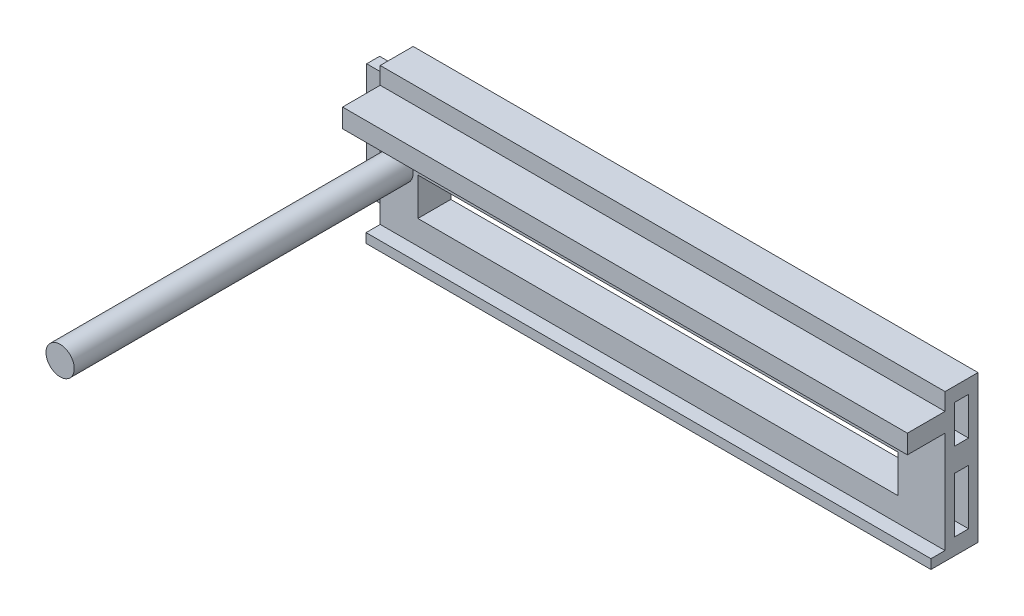
ISO-10303-21;
HEADER;
FILE_DESCRIPTION(('STEP AP214'),'2;1');
FILE_NAME('part.step','',(''),(''),'','','');
FILE_SCHEMA(('AUTOMOTIVE_DESIGN { 1 0 10303 214 1 1 1 1 }'));
ENDSEC;
DATA;
#1=APPLICATION_CONTEXT('core data for automotive mechanical design processes');
#2=APPLICATION_PROTOCOL_DEFINITION('international standard','automotive_design',2000,#1);
#3=PRODUCT_CONTEXT('',#1,'mechanical');
#4=PRODUCT('Part','Part','',(#3));
#5=PRODUCT_RELATED_PRODUCT_CATEGORY('part','',(#4));
#6=PRODUCT_DEFINITION_FORMATION('','',#4);
#7=PRODUCT_DEFINITION_CONTEXT('part definition',#1,'design');
#8=PRODUCT_DEFINITION('design','',#6,#7);
#9=PRODUCT_DEFINITION_SHAPE('','',#8);
#10=(LENGTH_UNIT() NAMED_UNIT(*) SI_UNIT(.MILLI.,.METRE.));
#11=(NAMED_UNIT(*) PLANE_ANGLE_UNIT() SI_UNIT($,.RADIAN.));
#12=(NAMED_UNIT(*) SI_UNIT($,.STERADIAN.) SOLID_ANGLE_UNIT());
#13=UNCERTAINTY_MEASURE_WITH_UNIT(LENGTH_MEASURE(1.E-05),#10,'distance_accuracy_value','');
#14=(GEOMETRIC_REPRESENTATION_CONTEXT(3) GLOBAL_UNCERTAINTY_ASSIGNED_CONTEXT((#13)) GLOBAL_UNIT_ASSIGNED_CONTEXT((#10,
#11,#12)) REPRESENTATION_CONTEXT('',''));
#15=CARTESIAN_POINT('',(0.,0.,0.));
#16=DIRECTION('',(0.,0.,1.));
#17=DIRECTION('',(1.,0.,0.));
#18=AXIS2_PLACEMENT_3D('',#15,#16,#17);
#19=CARTESIAN_POINT('',(0.,0.,7.));
#20=DIRECTION('',(1.,0.,0.));
#21=DIRECTION('',(0.,0.,-1.));
#22=AXIS2_PLACEMENT_3D('',#19,#20,#21);
#23=PLANE('',#22);
#24=DIRECTION('',(0.,-1.,0.));
#25=VECTOR('',#24,1.);
#26=CARTESIAN_POINT('',(0.,20.40938818,2.125));
#27=LINE('',#26,#25);
#28=CARTESIAN_POINT('',(0.,28.,2.125));
#29=VERTEX_POINT('',#28);
#30=CARTESIAN_POINT('',(0.,20.40938818,2.125));
#31=VERTEX_POINT('',#30);
#32=EDGE_CURVE('E467',#29,#31,#27,.T.);
#33=ORIENTED_EDGE('',*,*,#32,.F.);
#34=DIRECTION('',(0.,0.,-1.));
#35=VECTOR('',#34,1.);
#36=CARTESIAN_POINT('',(0.,28.,2.125));
#37=LINE('',#36,#35);
#38=CARTESIAN_POINT('',(0.,28.,4.875));
#39=VERTEX_POINT('',#38);
#40=EDGE_CURVE('E456',#39,#29,#37,.T.);
#41=ORIENTED_EDGE('',*,*,#40,.F.);
#42=DIRECTION('',(0.,1.,0.));
#43=VECTOR('',#42,1.);
#44=CARTESIAN_POINT('',(0.,20.40938818,4.875));
#45=LINE('',#44,#43);
#46=CARTESIAN_POINT('',(0.,20.40938818,4.875));
#47=VERTEX_POINT('',#46);
#48=EDGE_CURVE('E472',#47,#39,#45,.T.);
#49=ORIENTED_EDGE('',*,*,#48,.F.);
#50=DIRECTION('',(0.,0.,1.));
#51=VECTOR('',#50,1.);
#52=CARTESIAN_POINT('',(0.,20.40938818,2.125));
#53=LINE('',#52,#51);
#54=EDGE_CURVE('E468',#31,#47,#53,.T.);
#55=ORIENTED_EDGE('',*,*,#54,.F.);
#56=EDGE_LOOP('',(#33,#41,#49,#55));
#57=FACE_BOUND('',#56,.T.);
#58=DIRECTION('',(0.,-1.,0.));
#59=VECTOR('',#58,1.);
#60=CARTESIAN_POINT('',(0.,3.75,2.125));
#61=LINE('',#60,#59);
#62=CARTESIAN_POINT('',(0.,14.95,2.125));
#63=VERTEX_POINT('',#62);
#64=CARTESIAN_POINT('',(0.,3.75,2.125));
#65=VERTEX_POINT('',#64);
#66=EDGE_CURVE('E474',#63,#65,#61,.T.);
#67=ORIENTED_EDGE('',*,*,#66,.F.);
#68=DIRECTION('',(0.,0.,-1.));
#69=VECTOR('',#68,1.);
#70=CARTESIAN_POINT('',(0.,14.95,2.125));
#71=LINE('',#70,#69);
#72=CARTESIAN_POINT('',(0.,14.95,4.875));
#73=VERTEX_POINT('',#72);
#74=EDGE_CURVE('E511',#73,#63,#71,.T.);
#75=ORIENTED_EDGE('',*,*,#74,.F.);
#76=DIRECTION('',(0.,1.,0.));
#77=VECTOR('',#76,1.);
#78=CARTESIAN_POINT('',(0.,3.75,4.875));
#79=LINE('',#78,#77);
#80=CARTESIAN_POINT('',(0.,3.75,4.875));
#81=VERTEX_POINT('',#80);
#82=EDGE_CURVE('E520',#81,#73,#79,.T.);
#83=ORIENTED_EDGE('',*,*,#82,.F.);
#84=DIRECTION('',(0.,0.,1.));
#85=VECTOR('',#84,1.);
#86=CARTESIAN_POINT('',(0.,3.75,2.125));
#87=LINE('',#86,#85);
#88=EDGE_CURVE('E524',#65,#81,#87,.T.);
#89=ORIENTED_EDGE('',*,*,#88,.F.);
#90=EDGE_LOOP('',(#67,#75,#83,#89));
#91=FACE_BOUND('',#90,.T.);
#92=DIRECTION('',(0.,-1.,0.));
#93=VECTOR('',#92,1.);
#94=CARTESIAN_POINT('',(0.,0.,10.));
#95=LINE('',#94,#93);
#96=CARTESIAN_POINT('',(0.,2.,10.));
#97=VERTEX_POINT('',#96);
#98=CARTESIAN_POINT('',(0.,0.,10.));
#99=VERTEX_POINT('',#98);
#100=EDGE_CURVE('E268',#97,#99,#95,.T.);
#101=ORIENTED_EDGE('',*,*,#100,.F.);
#102=DIRECTION('',(0.,0.,-1.));
#103=VECTOR('',#102,1.);
#104=CARTESIAN_POINT('',(0.,2.,15.));
#105=LINE('',#104,#103);
#106=CARTESIAN_POINT('',(0.,2.,7.));
#107=VERTEX_POINT('',#106);
#108=EDGE_CURVE('E276',#97,#107,#105,.T.);
#109=ORIENTED_EDGE('',*,*,#108,.T.);
#110=DIRECTION('',(0.,-1.,0.));
#111=VECTOR('',#110,1.);
#112=CARTESIAN_POINT('',(0.,0.,7.));
#113=LINE('',#112,#111);
#114=CARTESIAN_POINT('',(0.,23.6,7.));
#115=VERTEX_POINT('',#114);
#116=EDGE_CURVE('E301',#115,#107,#113,.T.);
#117=ORIENTED_EDGE('',*,*,#116,.F.);
#118=DIRECTION('',(0.,0.,-1.));
#119=VECTOR('',#118,1.);
#120=CARTESIAN_POINT('',(0.,23.6,15.));
#121=LINE('',#120,#119);
#122=CARTESIAN_POINT('',(0.,23.6,15.));
#123=VERTEX_POINT('',#122);
#124=EDGE_CURVE('E312',#123,#115,#121,.T.);
#125=ORIENTED_EDGE('',*,*,#124,.F.);
#126=DIRECTION('',(0.,-1.,0.));
#127=VECTOR('',#126,1.);
#128=CARTESIAN_POINT('',(0.,27.6,15.));
#129=LINE('',#128,#127);
#130=CARTESIAN_POINT('',(0.,27.6,15.));
#131=VERTEX_POINT('',#130);
#132=EDGE_CURVE('E628',#131,#123,#129,.T.);
#133=ORIENTED_EDGE('',*,*,#132,.F.);
#134=DIRECTION('',(0.,0.,-1.));
#135=VECTOR('',#134,1.);
#136=CARTESIAN_POINT('',(0.,27.6,15.));
#137=LINE('',#136,#135);
#138=CARTESIAN_POINT('',(0.,27.6,7.));
#139=VERTEX_POINT('',#138);
#140=EDGE_CURVE('E645',#131,#139,#137,.T.);
#141=ORIENTED_EDGE('',*,*,#140,.T.);
#142=CARTESIAN_POINT('',(0.,31.25,7.));
#143=VERTEX_POINT('',#142);
#144=EDGE_CURVE('E300',#143,#139,#113,.T.);
#145=ORIENTED_EDGE('',*,*,#144,.F.);
#146=DIRECTION('',(0.,0.,-1.));
#147=VECTOR('',#146,1.);
#148=CARTESIAN_POINT('',(0.,31.25,7.));
#149=LINE('',#148,#147);
#150=CARTESIAN_POINT('',(0.,31.25,0.));
#151=VERTEX_POINT('',#150);
#152=EDGE_CURVE('E308',#143,#151,#149,.T.);
#153=ORIENTED_EDGE('',*,*,#152,.T.);
#154=DIRECTION('',(0.,-1.,0.));
#155=VECTOR('',#154,1.);
#156=CARTESIAN_POINT('',(0.,0.,0.));
#157=LINE('',#156,#155);
#158=CARTESIAN_POINT('',(0.,0.,0.));
#159=VERTEX_POINT('',#158);
#160=EDGE_CURVE('E307',#151,#159,#157,.T.);
#161=ORIENTED_EDGE('',*,*,#160,.T.);
#162=DIRECTION('',(0.,0.,-1.));
#163=VECTOR('',#162,1.);
#164=CARTESIAN_POINT('',(0.,0.,7.));
#165=LINE('',#164,#163);
#166=EDGE_CURVE('E52',#99,#159,#165,.T.);
#167=ORIENTED_EDGE('',*,*,#166,.F.);
#168=EDGE_LOOP('',(#101,#109,#117,#125,#133,#141,#145,#153,#161,#167));
#169=FACE_BOUND('',#168,.T.);
#170=ADVANCED_FACE('F44',(#57,#91,#169),#23,.F.);
#171=CARTESIAN_POINT('',(120.,0.,7.));
#172=DIRECTION('',(-1.,0.,0.));
#173=DIRECTION('',(0.,0.,1.));
#174=AXIS2_PLACEMENT_3D('',#171,#172,#173);
#175=PLANE('',#174);
#176=DIRECTION('',(0.,0.,-1.));
#177=VECTOR('',#176,1.);
#178=CARTESIAN_POINT('',(120.,3.5,5.));
#179=LINE('',#178,#177);
#180=CARTESIAN_POINT('',(120.,3.5,5.));
#181=VERTEX_POINT('',#180);
#182=CARTESIAN_POINT('',(120.,3.5,2.));
#183=VERTEX_POINT('',#182);
#184=EDGE_CURVE('E431',#181,#183,#179,.T.);
#185=ORIENTED_EDGE('',*,*,#184,.F.);
#186=DIRECTION('',(0.,-1.,0.));
#187=VECTOR('',#186,1.);
#188=CARTESIAN_POINT('',(120.,3.5,5.));
#189=LINE('',#188,#187);
#190=CARTESIAN_POINT('',(120.,15.1919851003935,5.));
#191=VERTEX_POINT('',#190);
#192=EDGE_CURVE('E389',#191,#181,#189,.T.);
#193=ORIENTED_EDGE('',*,*,#192,.F.);
#194=DIRECTION('',(0.,0.,1.));
#195=VECTOR('',#194,1.);
#196=CARTESIAN_POINT('',(120.,15.1919851003935,5.));
#197=LINE('',#196,#195);
#198=CARTESIAN_POINT('',(120.,15.1919851003935,2.));
#199=VERTEX_POINT('',#198);
#200=EDGE_CURVE('E422',#199,#191,#197,.T.);
#201=ORIENTED_EDGE('',*,*,#200,.F.);
#202=DIRECTION('',(0.,1.,0.));
#203=VECTOR('',#202,1.);
#204=CARTESIAN_POINT('',(120.,3.5,2.));
#205=LINE('',#204,#203);
#206=EDGE_CURVE('E428',#183,#199,#205,.T.);
#207=ORIENTED_EDGE('',*,*,#206,.F.);
#208=EDGE_LOOP('',(#185,#193,#201,#207));
#209=FACE_BOUND('',#208,.T.);
#210=DIRECTION('',(0.,0.,-1.));
#211=VECTOR('',#210,1.);
#212=CARTESIAN_POINT('',(120.,20.1919851003935,5.));
#213=LINE('',#212,#211);
#214=CARTESIAN_POINT('',(120.,20.1919851003935,5.));
#215=VERTEX_POINT('',#214);
#216=CARTESIAN_POINT('',(120.,20.1919851003935,2.));
#217=VERTEX_POINT('',#216);
#218=EDGE_CURVE('E383',#215,#217,#213,.T.);
#219=ORIENTED_EDGE('',*,*,#218,.F.);
#220=DIRECTION('',(0.,-1.,0.));
#221=VECTOR('',#220,1.);
#222=CARTESIAN_POINT('',(120.,20.1919851003935,5.));
#223=LINE('',#222,#221);
#224=CARTESIAN_POINT('',(120.,28.25,5.));
#225=VERTEX_POINT('',#224);
#226=EDGE_CURVE('E69',#225,#215,#223,.T.);
#227=ORIENTED_EDGE('',*,*,#226,.F.);
#228=DIRECTION('',(0.,0.,1.));
#229=VECTOR('',#228,1.);
#230=CARTESIAN_POINT('',(120.,28.25,5.));
#231=LINE('',#230,#229);
#232=CARTESIAN_POINT('',(120.,28.25,2.));
#233=VERTEX_POINT('',#232);
#234=EDGE_CURVE('E369',#233,#225,#231,.T.);
#235=ORIENTED_EDGE('',*,*,#234,.F.);
#236=DIRECTION('',(0.,1.,0.));
#237=VECTOR('',#236,1.);
#238=CARTESIAN_POINT('',(120.,20.1919851003935,2.));
#239=LINE('',#238,#237);
#240=EDGE_CURVE('E387',#217,#233,#239,.T.);
#241=ORIENTED_EDGE('',*,*,#240,.F.);
#242=EDGE_LOOP('',(#219,#227,#235,#241));
#243=FACE_BOUND('',#242,.T.);
#244=DIRECTION('',(0.,1.,0.));
#245=VECTOR('',#244,1.);
#246=CARTESIAN_POINT('',(120.,0.,10.));
#247=LINE('',#246,#245);
#248=CARTESIAN_POINT('',(120.,0.,10.));
#249=VERTEX_POINT('',#248);
#250=CARTESIAN_POINT('',(120.,2.,10.));
#251=VERTEX_POINT('',#250);
#252=EDGE_CURVE('E58',#249,#251,#247,.T.);
#253=ORIENTED_EDGE('',*,*,#252,.F.);
#254=DIRECTION('',(0.,0.,-1.));
#255=VECTOR('',#254,1.);
#256=CARTESIAN_POINT('',(120.,0.,7.));
#257=LINE('',#256,#255);
#258=CARTESIAN_POINT('',(120.,0.,0.));
#259=VERTEX_POINT('',#258);
#260=EDGE_CURVE('E330',#249,#259,#257,.T.);
#261=ORIENTED_EDGE('',*,*,#260,.T.);
#262=DIRECTION('',(0.,1.,0.));
#263=VECTOR('',#262,1.);
#264=CARTESIAN_POINT('',(120.,0.,0.));
#265=LINE('',#264,#263);
#266=CARTESIAN_POINT('',(120.,31.25,0.));
#267=VERTEX_POINT('',#266);
#268=EDGE_CURVE('E320',#259,#267,#265,.T.);
#269=ORIENTED_EDGE('',*,*,#268,.T.);
#270=DIRECTION('',(0.,0.,-1.));
#271=VECTOR('',#270,1.);
#272=CARTESIAN_POINT('',(120.,31.25,7.));
#273=LINE('',#272,#271);
#274=CARTESIAN_POINT('',(120.,31.25,7.));
#275=VERTEX_POINT('',#274);
#276=EDGE_CURVE('E326',#275,#267,#273,.T.);
#277=ORIENTED_EDGE('',*,*,#276,.F.);
#278=DIRECTION('',(0.,1.,0.));
#279=VECTOR('',#278,1.);
#280=CARTESIAN_POINT('',(120.,0.,7.));
#281=LINE('',#280,#279);
#282=CARTESIAN_POINT('',(120.,27.6,7.));
#283=VERTEX_POINT('',#282);
#284=EDGE_CURVE('E297',#283,#275,#281,.T.);
#285=ORIENTED_EDGE('',*,*,#284,.F.);
#286=DIRECTION('',(0.,0.,-1.));
#287=VECTOR('',#286,1.);
#288=CARTESIAN_POINT('',(120.,27.6,15.));
#289=LINE('',#288,#287);
#290=CARTESIAN_POINT('',(120.,27.6,15.));
#291=VERTEX_POINT('',#290);
#292=EDGE_CURVE('E652',#291,#283,#289,.T.);
#293=ORIENTED_EDGE('',*,*,#292,.F.);
#294=DIRECTION('',(0.,1.,0.));
#295=VECTOR('',#294,1.);
#296=CARTESIAN_POINT('',(120.,27.6,15.));
#297=LINE('',#296,#295);
#298=CARTESIAN_POINT('',(120.,23.6,15.));
#299=VERTEX_POINT('',#298);
#300=EDGE_CURVE('E636',#299,#291,#297,.T.);
#301=ORIENTED_EDGE('',*,*,#300,.F.);
#302=DIRECTION('',(0.,0.,-1.));
#303=VECTOR('',#302,1.);
#304=CARTESIAN_POINT('',(120.,23.6,15.));
#305=LINE('',#304,#303);
#306=CARTESIAN_POINT('',(120.,23.6,7.));
#307=VERTEX_POINT('',#306);
#308=EDGE_CURVE('E655',#299,#307,#305,.T.);
#309=ORIENTED_EDGE('',*,*,#308,.T.);
#310=CARTESIAN_POINT('',(120.,2.,7.));
#311=VERTEX_POINT('',#310);
#312=EDGE_CURVE('E302',#311,#307,#281,.T.);
#313=ORIENTED_EDGE('',*,*,#312,.F.);
#314=DIRECTION('',(0.,0.,-1.));
#315=VECTOR('',#314,1.);
#316=CARTESIAN_POINT('',(120.,2.,15.));
#317=LINE('',#316,#315);
#318=EDGE_CURVE('E289',#251,#311,#317,.T.);
#319=ORIENTED_EDGE('',*,*,#318,.F.);
#320=EDGE_LOOP('',(#253,#261,#269,#277,#285,#293,#301,#309,#313,#319));
#321=FACE_BOUND('',#320,.T.);
#322=ADVANCED_FACE('F353',(#209,#243,#321),#175,.F.);
#323=CARTESIAN_POINT('',(0.,2.,15.));
#324=DIRECTION('',(0.,-1.,0.));
#325=DIRECTION('',(0.,0.,-1.));
#326=AXIS2_PLACEMENT_3D('',#323,#324,#325);
#327=PLANE('',#326);
#328=DIRECTION('',(-1.,0.,0.));
#329=VECTOR('',#328,1.);
#330=CARTESIAN_POINT('',(120.001,2.,10.));
#331=LINE('',#330,#329);
#332=EDGE_CURVE('E264',#251,#97,#331,.T.);
#333=ORIENTED_EDGE('',*,*,#332,.F.);
#334=ORIENTED_EDGE('',*,*,#318,.T.);
#335=DIRECTION('',(-1.,0.,0.));
#336=VECTOR('',#335,1.);
#337=CARTESIAN_POINT('',(0.,2.,7.));
#338=LINE('',#337,#336);
#339=EDGE_CURVE('E285',#311,#107,#338,.T.);
#340=ORIENTED_EDGE('',*,*,#339,.T.);
#341=ORIENTED_EDGE('',*,*,#108,.F.);
#342=EDGE_LOOP('',(#333,#334,#340,#341));
#343=FACE_BOUND('',#342,.T.);
#344=ADVANCED_FACE('F284',(#343),#327,.F.);
#345=CARTESIAN_POINT('',(0.,0.,7.));
#346=DIRECTION('',(0.,0.,-1.));
#347=DIRECTION('',(-1.,0.,0.));
#348=AXIS2_PLACEMENT_3D('',#345,#346,#347);
#349=PLANE('',#348);
#350=DIRECTION('',(-1.,0.,0.));
#351=VECTOR('',#350,1.);
#352=CARTESIAN_POINT('',(0.,27.6,7.));
#353=LINE('',#352,#351);
#354=EDGE_CURVE('E633',#283,#139,#353,.T.);
#355=ORIENTED_EDGE('',*,*,#354,.F.);
#356=ORIENTED_EDGE('',*,*,#284,.T.);
#357=DIRECTION('',(-1.,0.,0.));
#358=VECTOR('',#357,1.);
#359=CARTESIAN_POINT('',(0.,31.25,7.));
#360=LINE('',#359,#358);
#361=EDGE_CURVE('E304',#275,#143,#360,.T.);
#362=ORIENTED_EDGE('',*,*,#361,.T.);
#363=ORIENTED_EDGE('',*,*,#144,.T.);
#364=EDGE_LOOP('',(#355,#356,#362,#363));
#365=FACE_BOUND('',#364,.T.);
#366=ADVANCED_FACE('F770',(#365),#349,.F.);
#367=CARTESIAN_POINT('',(4.,14.95,7.00000000000001));
#368=DIRECTION('',(0.,0.,-1.));
#369=DIRECTION('',(-1.,0.,0.));
#370=AXIS2_PLACEMENT_3D('',#367,#368,#369);
#371=CIRCLE('',#370,3.);
#372=CARTESIAN_POINT('',(0.999999999999999,14.95,7.00000000000001));
#373=VERTEX_POINT('',#372);
#374=EDGE_CURVE('E11',#373,#373,#371,.F.);
#375=ORIENTED_EDGE('',*,*,#374,.F.);
#376=EDGE_LOOP('',(#375));
#377=FACE_BOUND('',#376,.T.);
#378=DIRECTION('',(-1.,0.,0.));
#379=VECTOR('',#378,1.);
#380=CARTESIAN_POINT('',(0.,7.1,7.));
#381=LINE('',#380,#379);
#382=CARTESIAN_POINT('',(110.,7.1,7.));
#383=VERTEX_POINT('',#382);
#384=CARTESIAN_POINT('',(8.,7.1,7.));
#385=VERTEX_POINT('',#384);
#386=EDGE_CURVE('E612',#383,#385,#381,.T.);
#387=ORIENTED_EDGE('',*,*,#386,.T.);
#388=DIRECTION('',(0.,1.,0.));
#389=VECTOR('',#388,1.);
#390=CARTESIAN_POINT('',(8.,0.,7.));
#391=LINE('',#390,#389);
#392=CARTESIAN_POINT('',(8.,15.1,7.));
#393=VERTEX_POINT('',#392);
#394=EDGE_CURVE('E291',#385,#393,#391,.T.);
#395=ORIENTED_EDGE('',*,*,#394,.T.);
#396=DIRECTION('',(1.,0.,0.));
#397=VECTOR('',#396,1.);
#398=CARTESIAN_POINT('',(0.,15.1,7.));
#399=LINE('',#398,#397);
#400=CARTESIAN_POINT('',(110.,15.1,7.));
#401=VERTEX_POINT('',#400);
#402=EDGE_CURVE('E623',#393,#401,#399,.T.);
#403=ORIENTED_EDGE('',*,*,#402,.T.);
#404=DIRECTION('',(0.,-1.,0.));
#405=VECTOR('',#404,1.);
#406=CARTESIAN_POINT('',(110.,0.,7.));
#407=LINE('',#406,#405);
#408=EDGE_CURVE('E617',#401,#383,#407,.T.);
#409=ORIENTED_EDGE('',*,*,#408,.T.);
#410=EDGE_LOOP('',(#387,#395,#403,#409));
#411=FACE_BOUND('',#410,.T.);
#412=DIRECTION('',(-1.,0.,0.));
#413=VECTOR('',#412,1.);
#414=CARTESIAN_POINT('',(0.,20.1,7.));
#415=LINE('',#414,#413);
#416=CARTESIAN_POINT('',(110.,20.1,7.));
#417=VERTEX_POINT('',#416);
#418=CARTESIAN_POINT('',(8.,20.1,7.));
#419=VERTEX_POINT('',#418);
#420=EDGE_CURVE('E563',#417,#419,#415,.T.);
#421=ORIENTED_EDGE('',*,*,#420,.T.);
#422=DIRECTION('',(0.,1.,0.));
#423=VECTOR('',#422,1.);
#424=CARTESIAN_POINT('',(8.,0.,7.));
#425=LINE('',#424,#423);
#426=CARTESIAN_POINT('',(8.,23.6,7.));
#427=VERTEX_POINT('',#426);
#428=EDGE_CURVE('E608',#419,#427,#425,.T.);
#429=ORIENTED_EDGE('',*,*,#428,.T.);
#430=DIRECTION('',(1.,0.,0.));
#431=VECTOR('',#430,1.);
#432=CARTESIAN_POINT('',(0.,23.6,7.));
#433=LINE('',#432,#431);
#434=EDGE_CURVE('E644',#115,#427,#433,.T.);
#435=ORIENTED_EDGE('',*,*,#434,.F.);
#436=ORIENTED_EDGE('',*,*,#116,.T.);
#437=ORIENTED_EDGE('',*,*,#339,.F.);
#438=ORIENTED_EDGE('',*,*,#312,.T.);
#439=CARTESIAN_POINT('',(110.,23.6,7.));
#440=VERTEX_POINT('',#439);
#441=EDGE_CURVE('E293',#440,#307,#433,.T.);
#442=ORIENTED_EDGE('',*,*,#441,.F.);
#443=DIRECTION('',(0.,-1.,0.));
#444=VECTOR('',#443,1.);
#445=CARTESIAN_POINT('',(110.,0.,7.));
#446=LINE('',#445,#444);
#447=EDGE_CURVE('E602',#440,#417,#446,.T.);
#448=ORIENTED_EDGE('',*,*,#447,.T.);
#449=EDGE_LOOP('',(#421,#429,#435,#436,#437,#438,#442,#448));
#450=FACE_BOUND('',#449,.T.);
#451=ADVANCED_FACE('F667',(#377,#411,#450),#349,.F.);
#452=CARTESIAN_POINT('',(0.,0.,7.));
#453=DIRECTION('',(0.,1.,0.));
#454=DIRECTION('',(0.,0.,1.));
#455=AXIS2_PLACEMENT_3D('',#452,#453,#454);
#456=PLANE('',#455);
#457=ORIENTED_EDGE('',*,*,#260,.F.);
#458=DIRECTION('',(-1.,0.,0.));
#459=VECTOR('',#458,1.);
#460=CARTESIAN_POINT('',(120.001,0.,10.));
#461=LINE('',#460,#459);
#462=EDGE_CURVE('E275',#249,#99,#461,.T.);
#463=ORIENTED_EDGE('',*,*,#462,.T.);
#464=ORIENTED_EDGE('',*,*,#166,.T.);
#465=DIRECTION('',(1.,0.,0.));
#466=VECTOR('',#465,1.);
#467=CARTESIAN_POINT('',(0.,0.,0.));
#468=LINE('',#467,#466);
#469=EDGE_CURVE('E315',#159,#259,#468,.T.);
#470=ORIENTED_EDGE('',*,*,#469,.T.);
#471=EDGE_LOOP('',(#457,#463,#464,#470));
#472=FACE_BOUND('',#471,.T.);
#473=ADVANCED_FACE('F337',(#472),#456,.F.);
#474=CARTESIAN_POINT('',(0.,31.25,7.));
#475=DIRECTION('',(0.,-1.,0.));
#476=DIRECTION('',(0.,0.,-1.));
#477=AXIS2_PLACEMENT_3D('',#474,#475,#476);
#478=PLANE('',#477);
#479=DIRECTION('',(-1.,0.,0.));
#480=VECTOR('',#479,1.);
#481=CARTESIAN_POINT('',(0.,31.25,0.));
#482=LINE('',#481,#480);
#483=EDGE_CURVE('E318',#267,#151,#482,.T.);
#484=ORIENTED_EDGE('',*,*,#483,.T.);
#485=ORIENTED_EDGE('',*,*,#152,.F.);
#486=ORIENTED_EDGE('',*,*,#361,.F.);
#487=ORIENTED_EDGE('',*,*,#276,.T.);
#488=EDGE_LOOP('',(#484,#485,#486,#487));
#489=FACE_BOUND('',#488,.T.);
#490=ADVANCED_FACE('F347',(#489),#478,.F.);
#491=CARTESIAN_POINT('',(0.,0.,0.));
#492=DIRECTION('',(0.,0.,-1.));
#493=DIRECTION('',(-1.,0.,0.));
#494=AXIS2_PLACEMENT_3D('',#491,#492,#493);
#495=PLANE('',#494);
#496=DIRECTION('',(0.,-1.,0.));
#497=VECTOR('',#496,1.);
#498=CARTESIAN_POINT('',(8.,7.1,0.));
#499=LINE('',#498,#497);
#500=CARTESIAN_POINT('',(8.,15.1,0.));
#501=VERTEX_POINT('',#500);
#502=CARTESIAN_POINT('',(8.,7.1,0.));
#503=VERTEX_POINT('',#502);
#504=EDGE_CURVE('E541',#501,#503,#499,.T.);
#505=ORIENTED_EDGE('',*,*,#504,.T.);
#506=DIRECTION('',(1.,0.,0.));
#507=VECTOR('',#506,1.);
#508=CARTESIAN_POINT('',(8.,7.1,0.));
#509=LINE('',#508,#507);
#510=CARTESIAN_POINT('',(110.,7.1,0.));
#511=VERTEX_POINT('',#510);
#512=EDGE_CURVE('E545',#503,#511,#509,.T.);
#513=ORIENTED_EDGE('',*,*,#512,.T.);
#514=DIRECTION('',(0.,1.,0.));
#515=VECTOR('',#514,1.);
#516=CARTESIAN_POINT('',(110.,7.1,0.));
#517=LINE('',#516,#515);
#518=CARTESIAN_POINT('',(110.,15.1,0.));
#519=VERTEX_POINT('',#518);
#520=EDGE_CURVE('E546',#511,#519,#517,.T.);
#521=ORIENTED_EDGE('',*,*,#520,.T.);
#522=DIRECTION('',(-1.,0.,0.));
#523=VECTOR('',#522,1.);
#524=CARTESIAN_POINT('',(8.,15.1,0.));
#525=LINE('',#524,#523);
#526=EDGE_CURVE('E555',#519,#501,#525,.T.);
#527=ORIENTED_EDGE('',*,*,#526,.T.);
#528=EDGE_LOOP('',(#505,#513,#521,#527));
#529=FACE_BOUND('',#528,.T.);
#530=DIRECTION('',(0.,-1.,0.));
#531=VECTOR('',#530,1.);
#532=CARTESIAN_POINT('',(8.,20.1,0.));
#533=LINE('',#532,#531);
#534=CARTESIAN_POINT('',(8.,23.6,0.));
#535=VERTEX_POINT('',#534);
#536=CARTESIAN_POINT('',(8.,20.1,0.));
#537=VERTEX_POINT('',#536);
#538=EDGE_CURVE('E548',#535,#537,#533,.T.);
#539=ORIENTED_EDGE('',*,*,#538,.T.);
#540=DIRECTION('',(1.,0.,0.));
#541=VECTOR('',#540,1.);
#542=CARTESIAN_POINT('',(8.,20.1,0.));
#543=LINE('',#542,#541);
#544=CARTESIAN_POINT('',(110.,20.1,0.));
#545=VERTEX_POINT('',#544);
#546=EDGE_CURVE('E591',#537,#545,#543,.T.);
#547=ORIENTED_EDGE('',*,*,#546,.T.);
#548=DIRECTION('',(0.,1.,0.));
#549=VECTOR('',#548,1.);
#550=CARTESIAN_POINT('',(110.,20.1,0.));
#551=LINE('',#550,#549);
#552=CARTESIAN_POINT('',(110.,23.6,0.));
#553=VERTEX_POINT('',#552);
#554=EDGE_CURVE('E593',#545,#553,#551,.T.);
#555=ORIENTED_EDGE('',*,*,#554,.T.);
#556=DIRECTION('',(-1.,0.,0.));
#557=VECTOR('',#556,1.);
#558=CARTESIAN_POINT('',(8.,23.6,0.));
#559=LINE('',#558,#557);
#560=EDGE_CURVE('E580',#553,#535,#559,.T.);
#561=ORIENTED_EDGE('',*,*,#560,.T.);
#562=EDGE_LOOP('',(#539,#547,#555,#561));
#563=FACE_BOUND('',#562,.T.);
#564=ORIENTED_EDGE('',*,*,#160,.F.);
#565=ORIENTED_EDGE('',*,*,#483,.F.);
#566=ORIENTED_EDGE('',*,*,#268,.F.);
#567=ORIENTED_EDGE('',*,*,#469,.F.);
#568=EDGE_LOOP('',(#564,#565,#566,#567));
#569=FACE_BOUND('',#568,.T.);
#570=ADVANCED_FACE('F338',(#529,#563,#569),#495,.T.);
#571=CARTESIAN_POINT('',(0.,23.6,15.));
#572=DIRECTION('',(0.,1.,0.));
#573=DIRECTION('',(0.,0.,1.));
#574=AXIS2_PLACEMENT_3D('',#571,#572,#573);
#575=PLANE('',#574);
#576=ORIENTED_EDGE('',*,*,#434,.T.);
#577=DIRECTION('',(0.,0.,1.));
#578=VECTOR('',#577,1.);
#579=CARTESIAN_POINT('',(8.,23.6,0.));
#580=LINE('',#579,#578);
#581=EDGE_CURVE('E500',#535,#427,#580,.T.);
#582=ORIENTED_EDGE('',*,*,#581,.F.);
#583=ORIENTED_EDGE('',*,*,#560,.F.);
#584=DIRECTION('',(0.,0.,1.));
#585=VECTOR('',#584,1.);
#586=CARTESIAN_POINT('',(110.,23.6,0.));
#587=LINE('',#586,#585);
#588=EDGE_CURVE('E581',#553,#440,#587,.T.);
#589=ORIENTED_EDGE('',*,*,#588,.T.);
#590=ORIENTED_EDGE('',*,*,#441,.T.);
#591=ORIENTED_EDGE('',*,*,#308,.F.);
#592=DIRECTION('',(1.,0.,0.));
#593=VECTOR('',#592,1.);
#594=CARTESIAN_POINT('',(0.,23.6,15.));
#595=LINE('',#594,#593);
#596=EDGE_CURVE('E635',#123,#299,#595,.T.);
#597=ORIENTED_EDGE('',*,*,#596,.F.);
#598=ORIENTED_EDGE('',*,*,#124,.T.);
#599=EDGE_LOOP('',(#576,#582,#583,#589,#590,#591,#597,#598));
#600=FACE_BOUND('',#599,.T.);
#601=ADVANCED_FACE('F665',(#600),#575,.F.);
#602=CARTESIAN_POINT('',(0.,27.6,15.));
#603=DIRECTION('',(0.,-1.,0.));
#604=DIRECTION('',(0.,0.,-1.));
#605=AXIS2_PLACEMENT_3D('',#602,#603,#604);
#606=PLANE('',#605);
#607=ORIENTED_EDGE('',*,*,#354,.T.);
#608=ORIENTED_EDGE('',*,*,#140,.F.);
#609=DIRECTION('',(-1.,0.,0.));
#610=VECTOR('',#609,1.);
#611=CARTESIAN_POINT('',(0.,27.6,15.));
#612=LINE('',#611,#610);
#613=EDGE_CURVE('E638',#291,#131,#612,.T.);
#614=ORIENTED_EDGE('',*,*,#613,.F.);
#615=ORIENTED_EDGE('',*,*,#292,.T.);
#616=EDGE_LOOP('',(#607,#608,#614,#615));
#617=FACE_BOUND('',#616,.T.);
#618=ADVANCED_FACE('F695',(#617),#606,.F.);
#619=CARTESIAN_POINT('',(0.,0.,15.));
#620=DIRECTION('',(0.,0.,1.));
#621=DIRECTION('',(1.,0.,0.));
#622=AXIS2_PLACEMENT_3D('',#619,#620,#621);
#623=PLANE('',#622);
#624=ORIENTED_EDGE('',*,*,#132,.T.);
#625=ORIENTED_EDGE('',*,*,#596,.T.);
#626=ORIENTED_EDGE('',*,*,#300,.T.);
#627=ORIENTED_EDGE('',*,*,#613,.T.);
#628=EDGE_LOOP('',(#624,#625,#626,#627));
#629=FACE_BOUND('',#628,.T.);
#630=ADVANCED_FACE('F756',(#629),#623,.T.);
#631=CARTESIAN_POINT('',(8.,20.1,0.));
#632=DIRECTION('',(-1.,0.,0.));
#633=DIRECTION('',(0.,0.,1.));
#634=AXIS2_PLACEMENT_3D('',#631,#632,#633);
#635=PLANE('',#634);
#636=DIRECTION('',(0.,0.,1.));
#637=VECTOR('',#636,1.);
#638=CARTESIAN_POINT('',(8.,20.1,0.));
#639=LINE('',#638,#637);
#640=EDGE_CURVE('E573',#537,#419,#639,.T.);
#641=ORIENTED_EDGE('',*,*,#640,.F.);
#642=ORIENTED_EDGE('',*,*,#538,.F.);
#643=ORIENTED_EDGE('',*,*,#581,.T.);
#644=ORIENTED_EDGE('',*,*,#428,.F.);
#645=EDGE_LOOP('',(#641,#642,#643,#644));
#646=FACE_BOUND('',#645,.T.);
#647=ADVANCED_FACE('F681',(#646),#635,.F.);
#648=CARTESIAN_POINT('',(110.,20.1,0.));
#649=DIRECTION('',(1.,0.,0.));
#650=DIRECTION('',(0.,0.,-1.));
#651=AXIS2_PLACEMENT_3D('',#648,#649,#650);
#652=PLANE('',#651);
#653=ORIENTED_EDGE('',*,*,#588,.F.);
#654=ORIENTED_EDGE('',*,*,#554,.F.);
#655=DIRECTION('',(0.,0.,1.));
#656=VECTOR('',#655,1.);
#657=CARTESIAN_POINT('',(110.,20.1,0.));
#658=LINE('',#657,#656);
#659=EDGE_CURVE('E579',#545,#417,#658,.T.);
#660=ORIENTED_EDGE('',*,*,#659,.T.);
#661=ORIENTED_EDGE('',*,*,#447,.F.);
#662=EDGE_LOOP('',(#653,#654,#660,#661));
#663=FACE_BOUND('',#662,.T.);
#664=ADVANCED_FACE('F675',(#663),#652,.F.);
#665=CARTESIAN_POINT('',(8.,20.1,0.));
#666=DIRECTION('',(0.,-1.,0.));
#667=DIRECTION('',(0.,0.,-1.));
#668=AXIS2_PLACEMENT_3D('',#665,#666,#667);
#669=PLANE('',#668);
#670=ORIENTED_EDGE('',*,*,#659,.F.);
#671=ORIENTED_EDGE('',*,*,#546,.F.);
#672=ORIENTED_EDGE('',*,*,#640,.T.);
#673=ORIENTED_EDGE('',*,*,#420,.F.);
#674=EDGE_LOOP('',(#670,#671,#672,#673));
#675=FACE_BOUND('',#674,.T.);
#676=ADVANCED_FACE('F680',(#675),#669,.F.);
#677=CARTESIAN_POINT('',(8.,7.1,0.));
#678=DIRECTION('',(-1.,0.,0.));
#679=DIRECTION('',(0.,0.,1.));
#680=AXIS2_PLACEMENT_3D('',#677,#678,#679);
#681=PLANE('',#680);
#682=DIRECTION('',(0.,0.,1.));
#683=VECTOR('',#682,1.);
#684=CARTESIAN_POINT('',(8.,7.1,0.));
#685=LINE('',#684,#683);
#686=EDGE_CURVE('E556',#503,#385,#685,.T.);
#687=ORIENTED_EDGE('',*,*,#686,.F.);
#688=ORIENTED_EDGE('',*,*,#504,.F.);
#689=DIRECTION('',(0.,0.,1.));
#690=VECTOR('',#689,1.);
#691=CARTESIAN_POINT('',(8.,15.1,0.));
#692=LINE('',#691,#690);
#693=EDGE_CURVE('E559',#501,#393,#692,.T.);
#694=ORIENTED_EDGE('',*,*,#693,.T.);
#695=ORIENTED_EDGE('',*,*,#394,.F.);
#696=EDGE_LOOP('',(#687,#688,#694,#695));
#697=FACE_BOUND('',#696,.T.);
#698=ADVANCED_FACE('F742',(#697),#681,.F.);
#699=CARTESIAN_POINT('',(8.,15.1,0.));
#700=DIRECTION('',(0.,1.,0.));
#701=DIRECTION('',(0.,0.,1.));
#702=AXIS2_PLACEMENT_3D('',#699,#700,#701);
#703=PLANE('',#702);
#704=ORIENTED_EDGE('',*,*,#693,.F.);
#705=ORIENTED_EDGE('',*,*,#526,.F.);
#706=DIRECTION('',(0.,0.,1.));
#707=VECTOR('',#706,1.);
#708=CARTESIAN_POINT('',(110.,15.1,0.));
#709=LINE('',#708,#707);
#710=EDGE_CURVE('E562',#519,#401,#709,.T.);
#711=ORIENTED_EDGE('',*,*,#710,.T.);
#712=ORIENTED_EDGE('',*,*,#402,.F.);
#713=EDGE_LOOP('',(#704,#705,#711,#712));
#714=FACE_BOUND('',#713,.T.);
#715=ADVANCED_FACE('F738',(#714),#703,.F.);
#716=CARTESIAN_POINT('',(110.,7.1,0.));
#717=DIRECTION('',(1.,0.,0.));
#718=DIRECTION('',(0.,0.,-1.));
#719=AXIS2_PLACEMENT_3D('',#716,#717,#718);
#720=PLANE('',#719);
#721=ORIENTED_EDGE('',*,*,#710,.F.);
#722=ORIENTED_EDGE('',*,*,#520,.F.);
#723=DIRECTION('',(0.,0.,1.));
#724=VECTOR('',#723,1.);
#725=CARTESIAN_POINT('',(110.,7.1,0.));
#726=LINE('',#725,#724);
#727=EDGE_CURVE('E568',#511,#383,#726,.T.);
#728=ORIENTED_EDGE('',*,*,#727,.T.);
#729=ORIENTED_EDGE('',*,*,#408,.F.);
#730=EDGE_LOOP('',(#721,#722,#728,#729));
#731=FACE_BOUND('',#730,.T.);
#732=ADVANCED_FACE('F744',(#731),#720,.F.);
#733=CARTESIAN_POINT('',(8.,7.1,0.));
#734=DIRECTION('',(0.,-1.,0.));
#735=DIRECTION('',(0.,0.,-1.));
#736=AXIS2_PLACEMENT_3D('',#733,#734,#735);
#737=PLANE('',#736);
#738=ORIENTED_EDGE('',*,*,#727,.F.);
#739=ORIENTED_EDGE('',*,*,#512,.F.);
#740=ORIENTED_EDGE('',*,*,#686,.T.);
#741=ORIENTED_EDGE('',*,*,#386,.F.);
#742=EDGE_LOOP('',(#738,#739,#740,#741));
#743=FACE_BOUND('',#742,.T.);
#744=ADVANCED_FACE('F728',(#743),#737,.F.);
#745=CARTESIAN_POINT('',(-5.,3.75,2.125));
#746=DIRECTION('',(0.,0.,1.));
#747=DIRECTION('',(1.,0.,0.));
#748=AXIS2_PLACEMENT_3D('',#745,#746,#747);
#749=PLANE('',#748);
#750=ORIENTED_EDGE('',*,*,#66,.T.);
#751=DIRECTION('',(1.,0.,0.));
#752=VECTOR('',#751,1.);
#753=CARTESIAN_POINT('',(-5.,3.75,2.125));
#754=LINE('',#753,#752);
#755=CARTESIAN_POINT('',(-5.,3.75,2.125));
#756=VERTEX_POINT('',#755);
#757=EDGE_CURVE('E396',#756,#65,#754,.T.);
#758=ORIENTED_EDGE('',*,*,#757,.F.);
#759=DIRECTION('',(0.,-1.,0.));
#760=VECTOR('',#759,1.);
#761=CARTESIAN_POINT('',(-5.,3.75,2.125));
#762=LINE('',#761,#760);
#763=CARTESIAN_POINT('',(-5.,14.95,2.125));
#764=VERTEX_POINT('',#763);
#765=EDGE_CURVE('E518',#764,#756,#762,.T.);
#766=ORIENTED_EDGE('',*,*,#765,.F.);
#767=DIRECTION('',(1.,0.,0.));
#768=VECTOR('',#767,1.);
#769=CARTESIAN_POINT('',(-5.,14.95,2.125));
#770=LINE('',#769,#768);
#771=EDGE_CURVE('E508',#764,#63,#770,.T.);
#772=ORIENTED_EDGE('',*,*,#771,.T.);
#773=EDGE_LOOP('',(#750,#758,#766,#772));
#774=FACE_BOUND('',#773,.T.);
#775=ADVANCED_FACE('F713',(#774),#749,.F.);
#776=CARTESIAN_POINT('',(-5.,3.75,2.125));
#777=DIRECTION('',(0.,1.,0.));
#778=DIRECTION('',(0.,0.,1.));
#779=AXIS2_PLACEMENT_3D('',#776,#777,#778);
#780=PLANE('',#779);
#781=ORIENTED_EDGE('',*,*,#88,.T.);
#782=DIRECTION('',(1.,0.,0.));
#783=VECTOR('',#782,1.);
#784=CARTESIAN_POINT('',(-5.,3.75,4.875));
#785=LINE('',#784,#783);
#786=CARTESIAN_POINT('',(-5.,3.75,4.875));
#787=VERTEX_POINT('',#786);
#788=EDGE_CURVE('E501',#787,#81,#785,.T.);
#789=ORIENTED_EDGE('',*,*,#788,.F.);
#790=DIRECTION('',(0.,0.,1.));
#791=VECTOR('',#790,1.);
#792=CARTESIAN_POINT('',(-5.,3.75,2.125));
#793=LINE('',#792,#791);
#794=EDGE_CURVE('E533',#756,#787,#793,.T.);
#795=ORIENTED_EDGE('',*,*,#794,.F.);
#796=ORIENTED_EDGE('',*,*,#757,.T.);
#797=EDGE_LOOP('',(#781,#789,#795,#796));
#798=FACE_BOUND('',#797,.T.);
#799=ADVANCED_FACE('F724',(#798),#780,.F.);
#800=CARTESIAN_POINT('',(-5.,3.75,4.875));
#801=DIRECTION('',(0.,0.,-1.));
#802=DIRECTION('',(-1.,0.,0.));
#803=AXIS2_PLACEMENT_3D('',#800,#801,#802);
#804=PLANE('',#803);
#805=ORIENTED_EDGE('',*,*,#82,.T.);
#806=DIRECTION('',(1.,0.,0.));
#807=VECTOR('',#806,1.);
#808=CARTESIAN_POINT('',(-5.,14.95,4.875));
#809=LINE('',#808,#807);
#810=CARTESIAN_POINT('',(-5.,14.95,4.875));
#811=VERTEX_POINT('',#810);
#812=EDGE_CURVE('E504',#811,#73,#809,.T.);
#813=ORIENTED_EDGE('',*,*,#812,.F.);
#814=DIRECTION('',(0.,1.,0.));
#815=VECTOR('',#814,1.);
#816=CARTESIAN_POINT('',(-5.,3.75,4.875));
#817=LINE('',#816,#815);
#818=EDGE_CURVE('E535',#787,#811,#817,.T.);
#819=ORIENTED_EDGE('',*,*,#818,.F.);
#820=ORIENTED_EDGE('',*,*,#788,.T.);
#821=EDGE_LOOP('',(#805,#813,#819,#820));
#822=FACE_BOUND('',#821,.T.);
#823=ADVANCED_FACE('F720',(#822),#804,.F.);
#824=CARTESIAN_POINT('',(-5.,14.95,2.125));
#825=DIRECTION('',(0.,-1.,0.));
#826=DIRECTION('',(0.,0.,-1.));
#827=AXIS2_PLACEMENT_3D('',#824,#825,#826);
#828=PLANE('',#827);
#829=ORIENTED_EDGE('',*,*,#74,.T.);
#830=ORIENTED_EDGE('',*,*,#771,.F.);
#831=DIRECTION('',(0.,0.,-1.));
#832=VECTOR('',#831,1.);
#833=CARTESIAN_POINT('',(-5.,14.95,2.125));
#834=LINE('',#833,#832);
#835=EDGE_CURVE('E514',#811,#764,#834,.T.);
#836=ORIENTED_EDGE('',*,*,#835,.F.);
#837=ORIENTED_EDGE('',*,*,#812,.T.);
#838=EDGE_LOOP('',(#829,#830,#836,#837));
#839=FACE_BOUND('',#838,.T.);
#840=ADVANCED_FACE('F708',(#839),#828,.F.);
#841=CARTESIAN_POINT('',(-5.,0.,0.));
#842=DIRECTION('',(1.,0.,0.));
#843=DIRECTION('',(0.,0.,-1.));
#844=AXIS2_PLACEMENT_3D('',#841,#842,#843);
#845=PLANE('',#844);
#846=ORIENTED_EDGE('',*,*,#765,.T.);
#847=ORIENTED_EDGE('',*,*,#794,.T.);
#848=ORIENTED_EDGE('',*,*,#818,.T.);
#849=ORIENTED_EDGE('',*,*,#835,.T.);
#850=EDGE_LOOP('',(#846,#847,#848,#849));
#851=FACE_BOUND('',#850,.T.);
#852=ADVANCED_FACE('F716',(#851),#845,.F.);
#853=CARTESIAN_POINT('',(-5.,20.40938818,2.125));
#854=DIRECTION('',(0.,0.,1.));
#855=DIRECTION('',(1.,0.,0.));
#856=AXIS2_PLACEMENT_3D('',#853,#854,#855);
#857=PLANE('',#856);
#858=ORIENTED_EDGE('',*,*,#32,.T.);
#859=DIRECTION('',(1.,0.,0.));
#860=VECTOR('',#859,1.);
#861=CARTESIAN_POINT('',(-5.,20.40938818,2.125));
#862=LINE('',#861,#860);
#863=CARTESIAN_POINT('',(-5.,20.40938818,2.125));
#864=VERTEX_POINT('',#863);
#865=EDGE_CURVE('E491',#864,#31,#862,.T.);
#866=ORIENTED_EDGE('',*,*,#865,.F.);
#867=DIRECTION('',(0.,-1.,0.));
#868=VECTOR('',#867,1.);
#869=CARTESIAN_POINT('',(-5.,20.40938818,2.125));
#870=LINE('',#869,#868);
#871=CARTESIAN_POINT('',(-5.,28.,2.125));
#872=VERTEX_POINT('',#871);
#873=EDGE_CURVE('E454',#872,#864,#870,.T.);
#874=ORIENTED_EDGE('',*,*,#873,.F.);
#875=DIRECTION('',(1.,0.,0.));
#876=VECTOR('',#875,1.);
#877=CARTESIAN_POINT('',(-5.,28.,2.125));
#878=LINE('',#877,#876);
#879=EDGE_CURVE('E461',#872,#29,#878,.T.);
#880=ORIENTED_EDGE('',*,*,#879,.T.);
#881=EDGE_LOOP('',(#858,#866,#874,#880));
#882=FACE_BOUND('',#881,.T.);
#883=ADVANCED_FACE('F739',(#882),#857,.F.);
#884=CARTESIAN_POINT('',(-5.,20.40938818,2.125));
#885=DIRECTION('',(0.,1.,0.));
#886=DIRECTION('',(0.,0.,1.));
#887=AXIS2_PLACEMENT_3D('',#884,#885,#886);
#888=PLANE('',#887);
#889=ORIENTED_EDGE('',*,*,#54,.T.);
#890=DIRECTION('',(1.,0.,0.));
#891=VECTOR('',#890,1.);
#892=CARTESIAN_POINT('',(-5.,20.40938818,4.875));
#893=LINE('',#892,#891);
#894=CARTESIAN_POINT('',(-5.,20.40938818,4.875));
#895=VERTEX_POINT('',#894);
#896=EDGE_CURVE('E490',#895,#47,#893,.T.);
#897=ORIENTED_EDGE('',*,*,#896,.F.);
#898=DIRECTION('',(0.,0.,1.));
#899=VECTOR('',#898,1.);
#900=CARTESIAN_POINT('',(-5.,20.40938818,2.125));
#901=LINE('',#900,#899);
#902=EDGE_CURVE('E452',#864,#895,#901,.T.);
#903=ORIENTED_EDGE('',*,*,#902,.F.);
#904=ORIENTED_EDGE('',*,*,#865,.T.);
#905=EDGE_LOOP('',(#889,#897,#903,#904));
#906=FACE_BOUND('',#905,.T.);
#907=ADVANCED_FACE('F850',(#906),#888,.F.);
#908=CARTESIAN_POINT('',(-5.,20.40938818,4.875));
#909=DIRECTION('',(0.,0.,-1.));
#910=DIRECTION('',(-1.,0.,0.));
#911=AXIS2_PLACEMENT_3D('',#908,#909,#910);
#912=PLANE('',#911);
#913=ORIENTED_EDGE('',*,*,#48,.T.);
#914=DIRECTION('',(1.,0.,0.));
#915=VECTOR('',#914,1.);
#916=CARTESIAN_POINT('',(-5.,28.,4.875));
#917=LINE('',#916,#915);
#918=CARTESIAN_POINT('',(-5.,28.,4.875));
#919=VERTEX_POINT('',#918);
#920=EDGE_CURVE('E481',#919,#39,#917,.T.);
#921=ORIENTED_EDGE('',*,*,#920,.F.);
#922=DIRECTION('',(0.,1.,0.));
#923=VECTOR('',#922,1.);
#924=CARTESIAN_POINT('',(-5.,20.40938818,4.875));
#925=LINE('',#924,#923);
#926=EDGE_CURVE('E458',#895,#919,#925,.T.);
#927=ORIENTED_EDGE('',*,*,#926,.F.);
#928=ORIENTED_EDGE('',*,*,#896,.T.);
#929=EDGE_LOOP('',(#913,#921,#927,#928));
#930=FACE_BOUND('',#929,.T.);
#931=ADVANCED_FACE('F846',(#930),#912,.F.);
#932=CARTESIAN_POINT('',(-5.,28.,2.125));
#933=DIRECTION('',(0.,-1.,0.));
#934=DIRECTION('',(0.,0.,-1.));
#935=AXIS2_PLACEMENT_3D('',#932,#933,#934);
#936=PLANE('',#935);
#937=ORIENTED_EDGE('',*,*,#40,.T.);
#938=ORIENTED_EDGE('',*,*,#879,.F.);
#939=DIRECTION('',(0.,0.,-1.));
#940=VECTOR('',#939,1.);
#941=CARTESIAN_POINT('',(-5.,28.,2.125));
#942=LINE('',#941,#940);
#943=EDGE_CURVE('E464',#919,#872,#942,.T.);
#944=ORIENTED_EDGE('',*,*,#943,.F.);
#945=ORIENTED_EDGE('',*,*,#920,.T.);
#946=EDGE_LOOP('',(#937,#938,#944,#945));
#947=FACE_BOUND('',#946,.T.);
#948=ADVANCED_FACE('F841',(#947),#936,.F.);
#949=CARTESIAN_POINT('',(-5.,0.,0.));
#950=DIRECTION('',(1.,0.,0.));
#951=DIRECTION('',(0.,0.,-1.));
#952=AXIS2_PLACEMENT_3D('',#949,#950,#951);
#953=PLANE('',#952);
#954=ORIENTED_EDGE('',*,*,#873,.T.);
#955=ORIENTED_EDGE('',*,*,#902,.T.);
#956=ORIENTED_EDGE('',*,*,#926,.T.);
#957=ORIENTED_EDGE('',*,*,#943,.T.);
#958=EDGE_LOOP('',(#954,#955,#956,#957));
#959=FACE_BOUND('',#958,.T.);
#960=ADVANCED_FACE('F822',(#959),#953,.F.);
#961=CARTESIAN_POINT('',(115.,3.5,5.));
#962=DIRECTION('',(0.,0.,1.));
#963=DIRECTION('',(1.,0.,0.));
#964=AXIS2_PLACEMENT_3D('',#961,#962,#963);
#965=PLANE('',#964);
#966=ORIENTED_EDGE('',*,*,#192,.T.);
#967=DIRECTION('',(1.,0.,0.));
#968=VECTOR('',#967,1.);
#969=CARTESIAN_POINT('',(115.,3.5,5.));
#970=LINE('',#969,#968);
#971=CARTESIAN_POINT('',(115.,3.5,5.));
#972=VERTEX_POINT('',#971);
#973=EDGE_CURVE('E408',#972,#181,#970,.T.);
#974=ORIENTED_EDGE('',*,*,#973,.F.);
#975=DIRECTION('',(0.,-1.,0.));
#976=VECTOR('',#975,1.);
#977=CARTESIAN_POINT('',(115.,3.5,5.));
#978=LINE('',#977,#976);
#979=CARTESIAN_POINT('',(115.,15.1919851003935,5.));
#980=VERTEX_POINT('',#979);
#981=EDGE_CURVE('E430',#980,#972,#978,.T.);
#982=ORIENTED_EDGE('',*,*,#981,.F.);
#983=DIRECTION('',(1.,0.,0.));
#984=VECTOR('',#983,1.);
#985=CARTESIAN_POINT('',(115.,15.1919851003935,5.));
#986=LINE('',#985,#984);
#987=EDGE_CURVE('E361',#980,#191,#986,.T.);
#988=ORIENTED_EDGE('',*,*,#987,.T.);
#989=EDGE_LOOP('',(#966,#974,#982,#988));
#990=FACE_BOUND('',#989,.T.);
#991=ADVANCED_FACE('F817',(#990),#965,.F.);
#992=CARTESIAN_POINT('',(115.,15.1919851003935,5.));
#993=DIRECTION('',(0.,1.,0.));
#994=DIRECTION('',(0.,0.,1.));
#995=AXIS2_PLACEMENT_3D('',#992,#993,#994);
#996=PLANE('',#995);
#997=ORIENTED_EDGE('',*,*,#200,.T.);
#998=ORIENTED_EDGE('',*,*,#987,.F.);
#999=DIRECTION('',(0.,0.,1.));
#1000=VECTOR('',#999,1.);
#1001=CARTESIAN_POINT('',(115.,15.1919851003935,5.));
#1002=LINE('',#1001,#1000);
#1003=CARTESIAN_POINT('',(115.,15.1919851003935,2.));
#1004=VERTEX_POINT('',#1003);
#1005=EDGE_CURVE('E414',#1004,#980,#1002,.T.);
#1006=ORIENTED_EDGE('',*,*,#1005,.F.);
#1007=DIRECTION('',(1.,0.,0.));
#1008=VECTOR('',#1007,1.);
#1009=CARTESIAN_POINT('',(115.,15.1919851003935,2.));
#1010=LINE('',#1009,#1008);
#1011=EDGE_CURVE('E419',#1004,#199,#1010,.T.);
#1012=ORIENTED_EDGE('',*,*,#1011,.T.);
#1013=EDGE_LOOP('',(#997,#998,#1006,#1012));
#1014=FACE_BOUND('',#1013,.T.);
#1015=ADVANCED_FACE('F823',(#1014),#996,.F.);
#1016=CARTESIAN_POINT('',(115.,3.5,2.));
#1017=DIRECTION('',(0.,0.,-1.));
#1018=DIRECTION('',(-1.,0.,0.));
#1019=AXIS2_PLACEMENT_3D('',#1016,#1017,#1018);
#1020=PLANE('',#1019);
#1021=ORIENTED_EDGE('',*,*,#206,.T.);
#1022=ORIENTED_EDGE('',*,*,#1011,.F.);
#1023=DIRECTION('',(0.,1.,0.));
#1024=VECTOR('',#1023,1.);
#1025=CARTESIAN_POINT('',(115.,3.5,2.));
#1026=LINE('',#1025,#1024);
#1027=CARTESIAN_POINT('',(115.,3.5,2.));
#1028=VERTEX_POINT('',#1027);
#1029=EDGE_CURVE('E439',#1028,#1004,#1026,.T.);
#1030=ORIENTED_EDGE('',*,*,#1029,.F.);
#1031=DIRECTION('',(1.,0.,0.));
#1032=VECTOR('',#1031,1.);
#1033=CARTESIAN_POINT('',(115.,3.5,2.));
#1034=LINE('',#1033,#1032);
#1035=EDGE_CURVE('E413',#1028,#183,#1034,.T.);
#1036=ORIENTED_EDGE('',*,*,#1035,.T.);
#1037=EDGE_LOOP('',(#1021,#1022,#1030,#1036));
#1038=FACE_BOUND('',#1037,.T.);
#1039=ADVANCED_FACE('F827',(#1038),#1020,.F.);
#1040=CARTESIAN_POINT('',(115.,3.5,5.));
#1041=DIRECTION('',(0.,-1.,0.));
#1042=DIRECTION('',(0.,0.,-1.));
#1043=AXIS2_PLACEMENT_3D('',#1040,#1041,#1042);
#1044=PLANE('',#1043);
#1045=ORIENTED_EDGE('',*,*,#184,.T.);
#1046=ORIENTED_EDGE('',*,*,#1035,.F.);
#1047=DIRECTION('',(0.,0.,-1.));
#1048=VECTOR('',#1047,1.);
#1049=CARTESIAN_POINT('',(115.,3.5,5.));
#1050=LINE('',#1049,#1048);
#1051=EDGE_CURVE('E443',#972,#1028,#1050,.T.);
#1052=ORIENTED_EDGE('',*,*,#1051,.F.);
#1053=ORIENTED_EDGE('',*,*,#973,.T.);
#1054=EDGE_LOOP('',(#1045,#1046,#1052,#1053));
#1055=FACE_BOUND('',#1054,.T.);
#1056=ADVANCED_FACE('F826',(#1055),#1044,.F.);
#1057=CARTESIAN_POINT('',(115.,0.,0.));
#1058=DIRECTION('',(-1.,0.,0.));
#1059=DIRECTION('',(0.,0.,1.));
#1060=AXIS2_PLACEMENT_3D('',#1057,#1058,#1059);
#1061=PLANE('',#1060);
#1062=ORIENTED_EDGE('',*,*,#981,.T.);
#1063=ORIENTED_EDGE('',*,*,#1051,.T.);
#1064=ORIENTED_EDGE('',*,*,#1029,.T.);
#1065=ORIENTED_EDGE('',*,*,#1005,.T.);
#1066=EDGE_LOOP('',(#1062,#1063,#1064,#1065));
#1067=FACE_BOUND('',#1066,.T.);
#1068=ADVANCED_FACE('F819',(#1067),#1061,.F.);
#1069=CARTESIAN_POINT('',(115.,20.1919851003935,5.));
#1070=DIRECTION('',(0.,0.,1.));
#1071=DIRECTION('',(1.,0.,0.));
#1072=AXIS2_PLACEMENT_3D('',#1069,#1070,#1071);
#1073=PLANE('',#1072);
#1074=ORIENTED_EDGE('',*,*,#226,.T.);
#1075=DIRECTION('',(1.,0.,0.));
#1076=VECTOR('',#1075,1.);
#1077=CARTESIAN_POINT('',(115.,20.1919851003935,5.));
#1078=LINE('',#1077,#1076);
#1079=CARTESIAN_POINT('',(115.,20.1919851003935,5.));
#1080=VERTEX_POINT('',#1079);
#1081=EDGE_CURVE('E385',#1080,#215,#1078,.T.);
#1082=ORIENTED_EDGE('',*,*,#1081,.F.);
#1083=DIRECTION('',(0.,-1.,0.));
#1084=VECTOR('',#1083,1.);
#1085=CARTESIAN_POINT('',(115.,20.1919851003935,5.));
#1086=LINE('',#1085,#1084);
#1087=CARTESIAN_POINT('',(115.,28.25,5.));
#1088=VERTEX_POINT('',#1087);
#1089=EDGE_CURVE('E362',#1088,#1080,#1086,.T.);
#1090=ORIENTED_EDGE('',*,*,#1089,.F.);
#1091=DIRECTION('',(1.,0.,0.));
#1092=VECTOR('',#1091,1.);
#1093=CARTESIAN_POINT('',(115.,28.25,5.));
#1094=LINE('',#1093,#1092);
#1095=EDGE_CURVE('E399',#1088,#225,#1094,.T.);
#1096=ORIENTED_EDGE('',*,*,#1095,.T.);
#1097=EDGE_LOOP('',(#1074,#1082,#1090,#1096));
#1098=FACE_BOUND('',#1097,.T.);
#1099=ADVANCED_FACE('F810',(#1098),#1073,.F.);
#1100=CARTESIAN_POINT('',(115.,28.25,5.));
#1101=DIRECTION('',(0.,1.,0.));
#1102=DIRECTION('',(0.,0.,1.));
#1103=AXIS2_PLACEMENT_3D('',#1100,#1101,#1102);
#1104=PLANE('',#1103);
#1105=ORIENTED_EDGE('',*,*,#234,.T.);
#1106=ORIENTED_EDGE('',*,*,#1095,.F.);
#1107=DIRECTION('',(0.,0.,1.));
#1108=VECTOR('',#1107,1.);
#1109=CARTESIAN_POINT('',(115.,28.25,5.));
#1110=LINE('',#1109,#1108);
#1111=CARTESIAN_POINT('',(115.,28.25,2.));
#1112=VERTEX_POINT('',#1111);
#1113=EDGE_CURVE('E377',#1112,#1088,#1110,.T.);
#1114=ORIENTED_EDGE('',*,*,#1113,.F.);
#1115=DIRECTION('',(1.,0.,0.));
#1116=VECTOR('',#1115,1.);
#1117=CARTESIAN_POINT('',(115.,28.25,2.));
#1118=LINE('',#1117,#1116);
#1119=EDGE_CURVE('E402',#1112,#233,#1118,.T.);
#1120=ORIENTED_EDGE('',*,*,#1119,.T.);
#1121=EDGE_LOOP('',(#1105,#1106,#1114,#1120));
#1122=FACE_BOUND('',#1121,.T.);
#1123=ADVANCED_FACE('F805',(#1122),#1104,.F.);
#1124=CARTESIAN_POINT('',(115.,20.1919851003935,2.));
#1125=DIRECTION('',(0.,0.,-1.));
#1126=DIRECTION('',(-1.,0.,0.));
#1127=AXIS2_PLACEMENT_3D('',#1124,#1125,#1126);
#1128=PLANE('',#1127);
#1129=ORIENTED_EDGE('',*,*,#240,.T.);
#1130=ORIENTED_EDGE('',*,*,#1119,.F.);
#1131=DIRECTION('',(0.,1.,0.));
#1132=VECTOR('',#1131,1.);
#1133=CARTESIAN_POINT('',(115.,20.1919851003935,2.));
#1134=LINE('',#1133,#1132);
#1135=CARTESIAN_POINT('',(115.,20.1919851003935,2.));
#1136=VERTEX_POINT('',#1135);
#1137=EDGE_CURVE('E372',#1136,#1112,#1134,.T.);
#1138=ORIENTED_EDGE('',*,*,#1137,.F.);
#1139=DIRECTION('',(1.,0.,0.));
#1140=VECTOR('',#1139,1.);
#1141=CARTESIAN_POINT('',(115.,20.1919851003935,2.));
#1142=LINE('',#1141,#1140);
#1143=EDGE_CURVE('E404',#1136,#217,#1142,.T.);
#1144=ORIENTED_EDGE('',*,*,#1143,.T.);
#1145=EDGE_LOOP('',(#1129,#1130,#1138,#1144));
#1146=FACE_BOUND('',#1145,.T.);
#1147=ADVANCED_FACE('F807',(#1146),#1128,.F.);
#1148=CARTESIAN_POINT('',(115.,20.1919851003935,5.));
#1149=DIRECTION('',(0.,-1.,0.));
#1150=DIRECTION('',(0.,0.,-1.));
#1151=AXIS2_PLACEMENT_3D('',#1148,#1149,#1150);
#1152=PLANE('',#1151);
#1153=ORIENTED_EDGE('',*,*,#218,.T.);
#1154=ORIENTED_EDGE('',*,*,#1143,.F.);
#1155=DIRECTION('',(0.,0.,-1.));
#1156=VECTOR('',#1155,1.);
#1157=CARTESIAN_POINT('',(115.,20.1919851003935,5.));
#1158=LINE('',#1157,#1156);
#1159=EDGE_CURVE('E367',#1080,#1136,#1158,.T.);
#1160=ORIENTED_EDGE('',*,*,#1159,.F.);
#1161=ORIENTED_EDGE('',*,*,#1081,.T.);
#1162=EDGE_LOOP('',(#1153,#1154,#1160,#1161));
#1163=FACE_BOUND('',#1162,.T.);
#1164=ADVANCED_FACE('F804',(#1163),#1152,.F.);
#1165=CARTESIAN_POINT('',(115.,0.,0.));
#1166=DIRECTION('',(-1.,0.,0.));
#1167=DIRECTION('',(0.,0.,1.));
#1168=AXIS2_PLACEMENT_3D('',#1165,#1166,#1167);
#1169=PLANE('',#1168);
#1170=ORIENTED_EDGE('',*,*,#1089,.T.);
#1171=ORIENTED_EDGE('',*,*,#1159,.T.);
#1172=ORIENTED_EDGE('',*,*,#1137,.T.);
#1173=ORIENTED_EDGE('',*,*,#1113,.T.);
#1174=EDGE_LOOP('',(#1170,#1171,#1172,#1173));
#1175=FACE_BOUND('',#1174,.T.);
#1176=ADVANCED_FACE('F800',(#1175),#1169,.F.);
#1177=CARTESIAN_POINT('',(120.001,0.,10.));
#1178=DIRECTION('',(0.,0.,-1.));
#1179=DIRECTION('',(-1.,0.,0.));
#1180=AXIS2_PLACEMENT_3D('',#1177,#1178,#1179);
#1181=PLANE('',#1180);
#1182=ORIENTED_EDGE('',*,*,#252,.T.);
#1183=ORIENTED_EDGE('',*,*,#332,.T.);
#1184=ORIENTED_EDGE('',*,*,#100,.T.);
#1185=ORIENTED_EDGE('',*,*,#462,.F.);
#1186=EDGE_LOOP('',(#1182,#1183,#1184,#1185));
#1187=FACE_BOUND('',#1186,.T.);
#1188=ADVANCED_FACE('F265',(#1187),#1181,.F.);
#1189=CARTESIAN_POINT('',(4.,14.95,79.));
#1190=DIRECTION('',(0.,0.,-1.));
#1191=DIRECTION('',(-1.,0.,0.));
#1192=AXIS2_PLACEMENT_3D('',#1189,#1190,#1191);
#1193=CYLINDRICAL_SURFACE('',#1192,3.);
#1194=CARTESIAN_POINT('',(4.,14.95,79.));
#1195=DIRECTION('',(0.,0.,1.));
#1196=DIRECTION('',(1.,0.,0.));
#1197=AXIS2_PLACEMENT_3D('',#1194,#1195,#1196);
#1198=CIRCLE('',#1197,3.);
#1199=CARTESIAN_POINT('',(7.,14.95,79.));
#1200=VERTEX_POINT('',#1199);
#1201=EDGE_CURVE('E358',#1200,#1200,#1198,.T.);
#1202=ORIENTED_EDGE('',*,*,#1201,.F.);
#1203=EDGE_LOOP('',(#1202));
#1204=FACE_BOUND('',#1203,.T.);
#1205=ORIENTED_EDGE('',*,*,#374,.T.);
#1206=EDGE_LOOP('',(#1205));
#1207=FACE_BOUND('',#1206,.T.);
#1208=ADVANCED_FACE('F790',(#1204,#1207),#1193,.T.);
#1209=CARTESIAN_POINT('',(4.,14.95,79.));
#1210=DIRECTION('',(0.,0.,1.));
#1211=DIRECTION('',(1.,0.,0.));
#1212=AXIS2_PLACEMENT_3D('',#1209,#1210,#1211);
#1213=PLANE('',#1212);
#1214=ORIENTED_EDGE('',*,*,#1201,.T.);
#1215=EDGE_LOOP('',(#1214));
#1216=FACE_BOUND('',#1215,.T.);
#1217=ADVANCED_FACE('F786',(#1216),#1213,.T.);
#1218=CLOSED_SHELL('',(#170,#322,#344,#366,#451,#473,#490,#570,#601,#618,#630,#647,#664,#676,
#698,#715,#732,#744,#775,#799,#823,#840,#852,#883,#907,#931,#948,#960,#991,#1015,#1039,#1056,
#1068,#1099,#1123,#1147,#1164,#1176,#1188,#1208,#1217));
#1219=MANIFOLD_SOLID_BREP('B2',#1218);
#1220=ADVANCED_BREP_SHAPE_REPRESENTATION('',(#18,#1219),#14);
#1221=SHAPE_DEFINITION_REPRESENTATION(#9,#1220);
ENDSEC;
END-ISO-10303-21;
